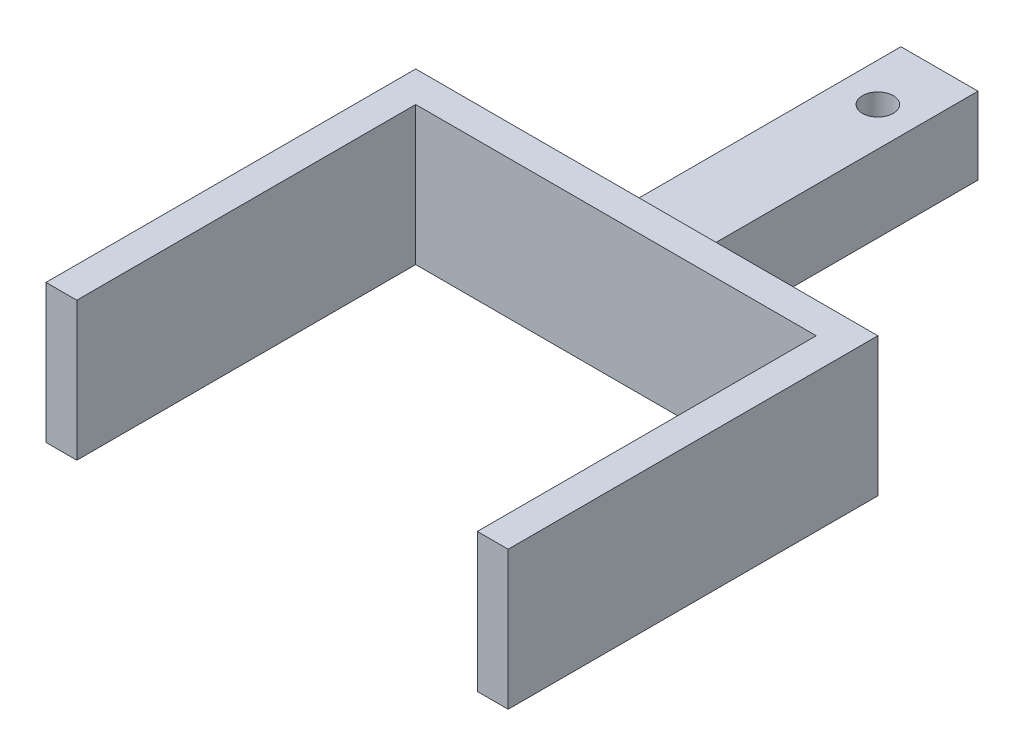
ISO-10303-21;
HEADER;
FILE_DESCRIPTION(('STEP AP214'),'2;1');
FILE_NAME('part.step','',(''),(''),'','','');
FILE_SCHEMA(('AUTOMOTIVE_DESIGN { 1 0 10303 214 1 1 1 1 }'));
ENDSEC;
DATA;
#1=APPLICATION_CONTEXT('core data for automotive mechanical design processes');
#2=APPLICATION_PROTOCOL_DEFINITION('international standard','automotive_design',2000,#1);
#3=PRODUCT_CONTEXT('',#1,'mechanical');
#4=PRODUCT('Part','Part','',(#3));
#5=PRODUCT_RELATED_PRODUCT_CATEGORY('part','',(#4));
#6=PRODUCT_DEFINITION_FORMATION('','',#4);
#7=PRODUCT_DEFINITION_CONTEXT('part definition',#1,'design');
#8=PRODUCT_DEFINITION('design','',#6,#7);
#9=PRODUCT_DEFINITION_SHAPE('','',#8);
#10=(LENGTH_UNIT() NAMED_UNIT(*) SI_UNIT(.MILLI.,.METRE.));
#11=(NAMED_UNIT(*) PLANE_ANGLE_UNIT() SI_UNIT($,.RADIAN.));
#12=(NAMED_UNIT(*) SI_UNIT($,.STERADIAN.) SOLID_ANGLE_UNIT());
#13=UNCERTAINTY_MEASURE_WITH_UNIT(LENGTH_MEASURE(1.E-05),#10,'distance_accuracy_value','');
#14=(GEOMETRIC_REPRESENTATION_CONTEXT(3) GLOBAL_UNCERTAINTY_ASSIGNED_CONTEXT((#13)) GLOBAL_UNIT_ASSIGNED_CONTEXT((#10,
#11,#12)) REPRESENTATION_CONTEXT('',''));
#15=CARTESIAN_POINT('',(0.,0.,0.));
#16=DIRECTION('',(0.,0.,1.));
#17=DIRECTION('',(1.,0.,0.));
#18=AXIS2_PLACEMENT_3D('',#15,#16,#17);
#19=CARTESIAN_POINT('',(-12.5,-35.,20.));
#20=DIRECTION('',(0.,1.,0.));
#21=DIRECTION('',(0.,0.,1.));
#22=AXIS2_PLACEMENT_3D('',#19,#20,#21);
#23=CYLINDRICAL_SURFACE('',#22,5.);
#24=CARTESIAN_POINT('',(-12.5,0.,20.));
#25=DIRECTION('',(0.,1.,0.));
#26=DIRECTION('',(0.,0.,1.));
#27=AXIS2_PLACEMENT_3D('',#24,#25,#26);
#28=CIRCLE('',#27,5.);
#29=CARTESIAN_POINT('',(-12.5,0.,25.));
#30=VERTEX_POINT('',#29);
#31=EDGE_CURVE('E146',#30,#30,#28,.T.);
#32=ORIENTED_EDGE('',*,*,#31,.T.);
#33=EDGE_LOOP('',(#32));
#34=FACE_BOUND('',#33,.T.);
#35=CARTESIAN_POINT('',(-12.5,-15.,20.));
#36=DIRECTION('',(0.,-1.,0.));
#37=DIRECTION('',(0.,0.,-1.));
#38=AXIS2_PLACEMENT_3D('',#35,#36,#37);
#39=CIRCLE('',#38,5.);
#40=CARTESIAN_POINT('',(-12.5,-15.,15.));
#41=VERTEX_POINT('',#40);
#42=EDGE_CURVE('E39',#41,#41,#39,.F.);
#43=ORIENTED_EDGE('',*,*,#42,.F.);
#44=EDGE_LOOP('',(#43));
#45=FACE_BOUND('',#44,.T.);
#46=ADVANCED_FACE('F35',(#34,#45),#23,.F.);
#47=CARTESIAN_POINT('',(0.,0.,95.));
#48=DIRECTION('',(-1.,0.,0.));
#49=DIRECTION('',(0.,0.,1.));
#50=AXIS2_PLACEMENT_3D('',#47,#48,#49);
#51=PLANE('',#50);
#52=DIRECTION('',(0.,1.,0.));
#53=VECTOR('',#52,1.);
#54=CARTESIAN_POINT('',(0.,0.,0.));
#55=LINE('',#54,#53);
#56=CARTESIAN_POINT('',(0.,-25.,0.));
#57=VERTEX_POINT('',#56);
#58=CARTESIAN_POINT('',(0.,0.,0.));
#59=VERTEX_POINT('',#58);
#60=EDGE_CURVE('E205',#57,#59,#55,.T.);
#61=ORIENTED_EDGE('',*,*,#60,.T.);
#62=DIRECTION('',(0.,0.,-1.));
#63=VECTOR('',#62,1.);
#64=CARTESIAN_POINT('',(0.,0.,95.));
#65=LINE('',#64,#63);
#66=CARTESIAN_POINT('',(0.,0.,95.));
#67=VERTEX_POINT('',#66);
#68=EDGE_CURVE('E11',#67,#59,#65,.T.);
#69=ORIENTED_EDGE('',*,*,#68,.F.);
#70=DIRECTION('',(0.,1.,0.));
#71=VECTOR('',#70,1.);
#72=CARTESIAN_POINT('',(0.,0.,95.));
#73=LINE('',#72,#71);
#74=CARTESIAN_POINT('',(0.,-25.,95.));
#75=VERTEX_POINT('',#74);
#76=EDGE_CURVE('E208',#75,#67,#73,.T.);
#77=ORIENTED_EDGE('',*,*,#76,.F.);
#78=DIRECTION('',(0.,0.,-1.));
#79=VECTOR('',#78,1.);
#80=CARTESIAN_POINT('',(0.,-25.,95.));
#81=LINE('',#80,#79);
#82=EDGE_CURVE('E218',#75,#57,#81,.T.);
#83=ORIENTED_EDGE('',*,*,#82,.T.);
#84=EDGE_LOOP('',(#61,#69,#77,#83));
#85=FACE_BOUND('',#84,.T.);
#86=ADVANCED_FACE('F37',(#85),#51,.F.);
#87=CARTESIAN_POINT('',(0.,0.,95.));
#88=DIRECTION('',(0.,-1.,0.));
#89=DIRECTION('',(0.,0.,-1.));
#90=AXIS2_PLACEMENT_3D('',#87,#88,#89);
#91=PLANE('',#90);
#92=ORIENTED_EDGE('',*,*,#31,.F.);
#93=EDGE_LOOP('',(#92));
#94=FACE_BOUND('',#93,.T.);
#95=DIRECTION('',(-1.,0.,0.));
#96=VECTOR('',#95,1.);
#97=CARTESIAN_POINT('',(0.,0.,0.));
#98=LINE('',#97,#96);
#99=CARTESIAN_POINT('',(-25.,0.,0.));
#100=VERTEX_POINT('',#99);
#101=EDGE_CURVE('E221',#59,#100,#98,.T.);
#102=ORIENTED_EDGE('',*,*,#101,.T.);
#103=DIRECTION('',(0.,0.,-1.));
#104=VECTOR('',#103,1.);
#105=CARTESIAN_POINT('',(-25.,0.,95.));
#106=LINE('',#105,#104);
#107=CARTESIAN_POINT('',(-25.,0.,95.));
#108=VERTEX_POINT('',#107);
#109=EDGE_CURVE('E45',#108,#100,#106,.T.);
#110=ORIENTED_EDGE('',*,*,#109,.F.);
#111=DIRECTION('',(-1.,0.,0.));
#112=VECTOR('',#111,1.);
#113=CARTESIAN_POINT('',(0.,0.,95.));
#114=LINE('',#113,#112);
#115=EDGE_CURVE('E79',#67,#108,#114,.T.);
#116=ORIENTED_EDGE('',*,*,#115,.F.);
#117=ORIENTED_EDGE('',*,*,#68,.T.);
#118=EDGE_LOOP('',(#102,#110,#116,#117));
#119=FACE_BOUND('',#118,.T.);
#120=ADVANCED_FACE('F281',(#94,#119),#91,.F.);
#121=CARTESIAN_POINT('',(-25.,0.,95.));
#122=DIRECTION('',(1.,0.,0.));
#123=DIRECTION('',(0.,0.,-1.));
#124=AXIS2_PLACEMENT_3D('',#121,#122,#123);
#125=PLANE('',#124);
#126=DIRECTION('',(0.,-1.,0.));
#127=VECTOR('',#126,1.);
#128=CARTESIAN_POINT('',(-25.,0.,0.));
#129=LINE('',#128,#127);
#130=CARTESIAN_POINT('',(-25.,-25.,0.));
#131=VERTEX_POINT('',#130);
#132=EDGE_CURVE('E69',#100,#131,#129,.T.);
#133=ORIENTED_EDGE('',*,*,#132,.T.);
#134=DIRECTION('',(0.,0.,-1.));
#135=VECTOR('',#134,1.);
#136=CARTESIAN_POINT('',(-25.,-25.,95.));
#137=LINE('',#136,#135);
#138=CARTESIAN_POINT('',(-25.,-25.,95.));
#139=VERTEX_POINT('',#138);
#140=EDGE_CURVE('E53',#139,#131,#137,.T.);
#141=ORIENTED_EDGE('',*,*,#140,.F.);
#142=DIRECTION('',(0.,-1.,0.));
#143=VECTOR('',#142,1.);
#144=CARTESIAN_POINT('',(-25.,0.,95.));
#145=LINE('',#144,#143);
#146=EDGE_CURVE('E212',#108,#139,#145,.T.);
#147=ORIENTED_EDGE('',*,*,#146,.F.);
#148=ORIENTED_EDGE('',*,*,#109,.T.);
#149=EDGE_LOOP('',(#133,#141,#147,#148));
#150=FACE_BOUND('',#149,.T.);
#151=ADVANCED_FACE('F227',(#150),#125,.F.);
#152=CARTESIAN_POINT('',(0.,-25.,95.));
#153=DIRECTION('',(0.,1.,0.));
#154=DIRECTION('',(0.,0.,1.));
#155=AXIS2_PLACEMENT_3D('',#152,#153,#154);
#156=PLANE('',#155);
#157=CARTESIAN_POINT('',(-12.4999999999744,-25.,20.0000000000058));
#158=DIRECTION('',(0.,-1.,0.));
#159=DIRECTION('',(0.,0.,-1.));
#160=AXIS2_PLACEMENT_3D('',#157,#158,#159);
#161=CIRCLE('',#160,9.99799233881573);
#162=CARTESIAN_POINT('',(-12.4999999999744,-25.,10.0020076611901));
#163=VERTEX_POINT('',#162);
#164=EDGE_CURVE('E263',#163,#163,#161,.T.);
#165=ORIENTED_EDGE('',*,*,#164,.F.);
#166=EDGE_LOOP('',(#165));
#167=FACE_BOUND('',#166,.T.);
#168=DIRECTION('',(1.,0.,0.));
#169=VECTOR('',#168,1.);
#170=CARTESIAN_POINT('',(0.,-25.,0.));
#171=LINE('',#170,#169);
#172=EDGE_CURVE('E74',#131,#57,#171,.T.);
#173=ORIENTED_EDGE('',*,*,#172,.T.);
#174=ORIENTED_EDGE('',*,*,#82,.F.);
#175=DIRECTION('',(1.,0.,0.));
#176=VECTOR('',#175,1.);
#177=CARTESIAN_POINT('',(0.,-25.,95.));
#178=LINE('',#177,#176);
#179=EDGE_CURVE('E215',#139,#75,#178,.T.);
#180=ORIENTED_EDGE('',*,*,#179,.F.);
#181=ORIENTED_EDGE('',*,*,#140,.T.);
#182=EDGE_LOOP('',(#173,#174,#180,#181));
#183=FACE_BOUND('',#182,.T.);
#184=ADVANCED_FACE('F232',(#167,#183),#156,.F.);
#185=CARTESIAN_POINT('',(0.,0.,0.));
#186=DIRECTION('',(0.,0.,-1.));
#187=DIRECTION('',(-1.,0.,0.));
#188=AXIS2_PLACEMENT_3D('',#185,#186,#187);
#189=PLANE('',#188);
#190=ORIENTED_EDGE('',*,*,#60,.F.);
#191=ORIENTED_EDGE('',*,*,#172,.F.);
#192=ORIENTED_EDGE('',*,*,#132,.F.);
#193=ORIENTED_EDGE('',*,*,#101,.F.);
#194=EDGE_LOOP('',(#190,#191,#192,#193));
#195=FACE_BOUND('',#194,.T.);
#196=ADVANCED_FACE('F230',(#195),#189,.T.);
#197=CARTESIAN_POINT('',(52.5,-35.,105.));
#198=DIRECTION('',(0.,1.,0.));
#199=DIRECTION('',(-1.,0.,0.));
#200=AXIS2_PLACEMENT_3D('',#197,#198,#199);
#201=PLANE('',#200);
#202=DIRECTION('',(1.,0.,0.));
#203=VECTOR('',#202,1.);
#204=CARTESIAN_POINT('',(52.5,-35.,95.));
#205=LINE('',#204,#203);
#206=CARTESIAN_POINT('',(-87.5,-35.,95.));
#207=VERTEX_POINT('',#206);
#208=CARTESIAN_POINT('',(62.5,-35.,95.));
#209=VERTEX_POINT('',#208);
#210=EDGE_CURVE('E181',#207,#209,#205,.T.);
#211=ORIENTED_EDGE('',*,*,#210,.T.);
#212=DIRECTION('',(0.,0.,1.));
#213=VECTOR('',#212,1.);
#214=CARTESIAN_POINT('',(62.5,-35.,95.));
#215=LINE('',#214,#213);
#216=CARTESIAN_POINT('',(62.5,-35.,215.));
#217=VERTEX_POINT('',#216);
#218=EDGE_CURVE('E172',#209,#217,#215,.T.);
#219=ORIENTED_EDGE('',*,*,#218,.T.);
#220=DIRECTION('',(-1.,0.,0.));
#221=VECTOR('',#220,1.);
#222=CARTESIAN_POINT('',(52.5,-35.,215.));
#223=LINE('',#222,#221);
#224=CARTESIAN_POINT('',(52.5,-35.,215.));
#225=VERTEX_POINT('',#224);
#226=EDGE_CURVE('E168',#217,#225,#223,.T.);
#227=ORIENTED_EDGE('',*,*,#226,.T.);
#228=DIRECTION('',(0.,0.,-1.));
#229=VECTOR('',#228,1.);
#230=CARTESIAN_POINT('',(52.5,-35.,95.));
#231=LINE('',#230,#229);
#232=CARTESIAN_POINT('',(52.5,-35.,105.));
#233=VERTEX_POINT('',#232);
#234=EDGE_CURVE('E153',#225,#233,#231,.T.);
#235=ORIENTED_EDGE('',*,*,#234,.T.);
#236=DIRECTION('',(1.,0.,0.));
#237=VECTOR('',#236,1.);
#238=CARTESIAN_POINT('',(52.5,-35.,105.));
#239=LINE('',#238,#237);
#240=CARTESIAN_POINT('',(-77.5,-35.,105.));
#241=VERTEX_POINT('',#240);
#242=EDGE_CURVE('E198',#241,#233,#239,.T.);
#243=ORIENTED_EDGE('',*,*,#242,.F.);
#244=DIRECTION('',(0.,0.,1.));
#245=VECTOR('',#244,1.);
#246=CARTESIAN_POINT('',(-77.5,-35.,95.));
#247=LINE('',#246,#245);
#248=CARTESIAN_POINT('',(-77.5,-35.,215.));
#249=VERTEX_POINT('',#248);
#250=EDGE_CURVE('E179',#241,#249,#247,.T.);
#251=ORIENTED_EDGE('',*,*,#250,.T.);
#252=DIRECTION('',(-1.,0.,0.));
#253=VECTOR('',#252,1.);
#254=CARTESIAN_POINT('',(-77.5,-35.,215.));
#255=LINE('',#254,#253);
#256=CARTESIAN_POINT('',(-87.5,-35.,215.));
#257=VERTEX_POINT('',#256);
#258=EDGE_CURVE('E176',#249,#257,#255,.T.);
#259=ORIENTED_EDGE('',*,*,#258,.T.);
#260=DIRECTION('',(0.,0.,-1.));
#261=VECTOR('',#260,1.);
#262=CARTESIAN_POINT('',(-87.5,-35.,95.));
#263=LINE('',#262,#261);
#264=EDGE_CURVE('E173',#257,#207,#263,.T.);
#265=ORIENTED_EDGE('',*,*,#264,.T.);
#266=EDGE_LOOP('',(#211,#219,#227,#235,#243,#251,#259,#265));
#267=FACE_BOUND('',#266,.T.);
#268=ADVANCED_FACE('F246',(#267),#201,.F.);
#269=CARTESIAN_POINT('',(52.5,9.99999999999999,105.));
#270=DIRECTION('',(0.,-1.,0.));
#271=DIRECTION('',(1.,0.,0.));
#272=AXIS2_PLACEMENT_3D('',#269,#270,#271);
#273=PLANE('',#272);
#274=DIRECTION('',(-1.,0.,0.));
#275=VECTOR('',#274,1.);
#276=CARTESIAN_POINT('',(52.5,9.99999999999999,95.));
#277=LINE('',#276,#275);
#278=CARTESIAN_POINT('',(62.5,9.99999999999999,95.));
#279=VERTEX_POINT('',#278);
#280=CARTESIAN_POINT('',(-87.5,9.99999999999997,95.));
#281=VERTEX_POINT('',#280);
#282=EDGE_CURVE('E199',#279,#281,#277,.T.);
#283=ORIENTED_EDGE('',*,*,#282,.T.);
#284=DIRECTION('',(0.,0.,1.));
#285=VECTOR('',#284,1.);
#286=CARTESIAN_POINT('',(-87.5,9.99999999999997,95.));
#287=LINE('',#286,#285);
#288=CARTESIAN_POINT('',(-87.5,9.99999999999997,215.));
#289=VERTEX_POINT('',#288);
#290=EDGE_CURVE('E183',#281,#289,#287,.T.);
#291=ORIENTED_EDGE('',*,*,#290,.T.);
#292=DIRECTION('',(1.,0.,0.));
#293=VECTOR('',#292,1.);
#294=CARTESIAN_POINT('',(-77.5,9.99999999999998,215.));
#295=LINE('',#294,#293);
#296=CARTESIAN_POINT('',(-77.5,9.99999999999998,215.));
#297=VERTEX_POINT('',#296);
#298=EDGE_CURVE('E186',#289,#297,#295,.T.);
#299=ORIENTED_EDGE('',*,*,#298,.T.);
#300=DIRECTION('',(0.,0.,-1.));
#301=VECTOR('',#300,1.);
#302=CARTESIAN_POINT('',(-77.5,9.99999999999998,95.));
#303=LINE('',#302,#301);
#304=CARTESIAN_POINT('',(-77.5,9.99999999999998,105.));
#305=VERTEX_POINT('',#304);
#306=EDGE_CURVE('E171',#297,#305,#303,.T.);
#307=ORIENTED_EDGE('',*,*,#306,.T.);
#308=DIRECTION('',(-1.,0.,0.));
#309=VECTOR('',#308,1.);
#310=CARTESIAN_POINT('',(52.5,9.99999999999999,105.));
#311=LINE('',#310,#309);
#312=CARTESIAN_POINT('',(52.5,9.99999999999999,105.));
#313=VERTEX_POINT('',#312);
#314=EDGE_CURVE('E143',#313,#305,#311,.T.);
#315=ORIENTED_EDGE('',*,*,#314,.F.);
#316=DIRECTION('',(0.,0.,1.));
#317=VECTOR('',#316,1.);
#318=CARTESIAN_POINT('',(52.5,9.99999999999999,95.));
#319=LINE('',#318,#317);
#320=CARTESIAN_POINT('',(52.5,9.99999999999999,215.));
#321=VERTEX_POINT('',#320);
#322=EDGE_CURVE('E134',#313,#321,#319,.T.);
#323=ORIENTED_EDGE('',*,*,#322,.T.);
#324=DIRECTION('',(1.,0.,0.));
#325=VECTOR('',#324,1.);
#326=CARTESIAN_POINT('',(52.5,9.99999999999999,215.));
#327=LINE('',#326,#325);
#328=CARTESIAN_POINT('',(62.5,9.99999999999999,215.));
#329=VERTEX_POINT('',#328);
#330=EDGE_CURVE('E139',#321,#329,#327,.T.);
#331=ORIENTED_EDGE('',*,*,#330,.T.);
#332=DIRECTION('',(0.,0.,-1.));
#333=VECTOR('',#332,1.);
#334=CARTESIAN_POINT('',(62.5,9.99999999999999,95.));
#335=LINE('',#334,#333);
#336=EDGE_CURVE('E157',#329,#279,#335,.T.);
#337=ORIENTED_EDGE('',*,*,#336,.T.);
#338=EDGE_LOOP('',(#283,#291,#299,#307,#315,#323,#331,#337));
#339=FACE_BOUND('',#338,.T.);
#340=ADVANCED_FACE('F136',(#339),#273,.F.);
#341=CARTESIAN_POINT('',(0.,0.,105.));
#342=DIRECTION('',(0.,0.,-1.));
#343=DIRECTION('',(-1.,0.,0.));
#344=AXIS2_PLACEMENT_3D('',#341,#342,#343);
#345=PLANE('',#344);
#346=DIRECTION('',(0.,-1.,0.));
#347=VECTOR('',#346,1.);
#348=CARTESIAN_POINT('',(-77.5,9.99999999999998,105.));
#349=LINE('',#348,#347);
#350=EDGE_CURVE('E195',#305,#241,#349,.T.);
#351=ORIENTED_EDGE('',*,*,#350,.T.);
#352=ORIENTED_EDGE('',*,*,#242,.T.);
#353=DIRECTION('',(0.,1.,0.));
#354=VECTOR('',#353,1.);
#355=CARTESIAN_POINT('',(52.5,9.99999999999999,105.));
#356=LINE('',#355,#354);
#357=EDGE_CURVE('E202',#233,#313,#356,.T.);
#358=ORIENTED_EDGE('',*,*,#357,.T.);
#359=ORIENTED_EDGE('',*,*,#314,.T.);
#360=EDGE_LOOP('',(#351,#352,#358,#359));
#361=FACE_BOUND('',#360,.T.);
#362=ADVANCED_FACE('F238',(#361),#345,.F.);
#363=CARTESIAN_POINT('',(0.,0.,95.));
#364=DIRECTION('',(0.,0.,-1.));
#365=DIRECTION('',(-1.,0.,0.));
#366=AXIS2_PLACEMENT_3D('',#363,#364,#365);
#367=PLANE('',#366);
#368=ORIENTED_EDGE('',*,*,#179,.T.);
#369=ORIENTED_EDGE('',*,*,#76,.T.);
#370=ORIENTED_EDGE('',*,*,#115,.T.);
#371=ORIENTED_EDGE('',*,*,#146,.T.);
#372=EDGE_LOOP('',(#368,#369,#370,#371));
#373=FACE_BOUND('',#372,.T.);
#374=ORIENTED_EDGE('',*,*,#210,.F.);
#375=DIRECTION('',(0.,1.,0.));
#376=VECTOR('',#375,1.);
#377=CARTESIAN_POINT('',(-87.5,-155.415945787923,95.));
#378=LINE('',#377,#376);
#379=EDGE_CURVE('E189',#207,#281,#378,.T.);
#380=ORIENTED_EDGE('',*,*,#379,.T.);
#381=ORIENTED_EDGE('',*,*,#282,.F.);
#382=DIRECTION('',(0.,1.,0.));
#383=VECTOR('',#382,1.);
#384=CARTESIAN_POINT('',(62.5,-155.415945787923,95.));
#385=LINE('',#384,#383);
#386=EDGE_CURVE('E165',#209,#279,#385,.T.);
#387=ORIENTED_EDGE('',*,*,#386,.F.);
#388=EDGE_LOOP('',(#374,#380,#381,#387));
#389=FACE_BOUND('',#388,.T.);
#390=ADVANCED_FACE('F234',(#373,#389),#367,.T.);
#391=CARTESIAN_POINT('',(-77.5,-155.415945787923,95.));
#392=DIRECTION('',(1.,0.,0.));
#393=DIRECTION('',(0.,1.,0.));
#394=AXIS2_PLACEMENT_3D('',#391,#392,#393);
#395=PLANE('',#394);
#396=ORIENTED_EDGE('',*,*,#350,.F.);
#397=ORIENTED_EDGE('',*,*,#306,.F.);
#398=DIRECTION('',(0.,1.,0.));
#399=VECTOR('',#398,1.);
#400=CARTESIAN_POINT('',(-77.5,-155.415945787923,215.));
#401=LINE('',#400,#399);
#402=EDGE_CURVE('E177',#249,#297,#401,.T.);
#403=ORIENTED_EDGE('',*,*,#402,.F.);
#404=ORIENTED_EDGE('',*,*,#250,.F.);
#405=EDGE_LOOP('',(#396,#397,#403,#404));
#406=FACE_BOUND('',#405,.T.);
#407=ADVANCED_FACE('F237',(#406),#395,.T.);
#408=CARTESIAN_POINT('',(-77.5,-155.415945787923,215.));
#409=DIRECTION('',(0.,0.,1.));
#410=DIRECTION('',(1.,0.,0.));
#411=AXIS2_PLACEMENT_3D('',#408,#409,#410);
#412=PLANE('',#411);
#413=ORIENTED_EDGE('',*,*,#258,.F.);
#414=ORIENTED_EDGE('',*,*,#402,.T.);
#415=ORIENTED_EDGE('',*,*,#298,.F.);
#416=DIRECTION('',(0.,1.,0.));
#417=VECTOR('',#416,1.);
#418=CARTESIAN_POINT('',(-87.5,-155.415945787923,215.));
#419=LINE('',#418,#417);
#420=EDGE_CURVE('E191',#257,#289,#419,.T.);
#421=ORIENTED_EDGE('',*,*,#420,.F.);
#422=EDGE_LOOP('',(#413,#414,#415,#421));
#423=FACE_BOUND('',#422,.T.);
#424=ADVANCED_FACE('F253',(#423),#412,.T.);
#425=CARTESIAN_POINT('',(-87.5,-155.415945787923,95.));
#426=DIRECTION('',(-1.,0.,0.));
#427=DIRECTION('',(0.,-1.,0.));
#428=AXIS2_PLACEMENT_3D('',#425,#426,#427);
#429=PLANE('',#428);
#430=ORIENTED_EDGE('',*,*,#264,.F.);
#431=ORIENTED_EDGE('',*,*,#420,.T.);
#432=ORIENTED_EDGE('',*,*,#290,.F.);
#433=ORIENTED_EDGE('',*,*,#379,.F.);
#434=EDGE_LOOP('',(#430,#431,#432,#433));
#435=FACE_BOUND('',#434,.T.);
#436=ADVANCED_FACE('F250',(#435),#429,.T.);
#437=CARTESIAN_POINT('',(52.5,-155.415945787923,95.));
#438=DIRECTION('',(-1.,0.,0.));
#439=DIRECTION('',(0.,-1.,0.));
#440=AXIS2_PLACEMENT_3D('',#437,#438,#439);
#441=PLANE('',#440);
#442=ORIENTED_EDGE('',*,*,#357,.F.);
#443=ORIENTED_EDGE('',*,*,#234,.F.);
#444=DIRECTION('',(0.,1.,0.));
#445=VECTOR('',#444,1.);
#446=CARTESIAN_POINT('',(52.5,-155.415945787923,215.));
#447=LINE('',#446,#445);
#448=EDGE_CURVE('E150',#225,#321,#447,.T.);
#449=ORIENTED_EDGE('',*,*,#448,.T.);
#450=ORIENTED_EDGE('',*,*,#322,.F.);
#451=EDGE_LOOP('',(#442,#443,#449,#450));
#452=FACE_BOUND('',#451,.T.);
#453=ADVANCED_FACE('F151',(#452),#441,.T.);
#454=CARTESIAN_POINT('',(62.5,-155.415945787923,95.));
#455=DIRECTION('',(1.,0.,0.));
#456=DIRECTION('',(0.,1.,0.));
#457=AXIS2_PLACEMENT_3D('',#454,#455,#456);
#458=PLANE('',#457);
#459=ORIENTED_EDGE('',*,*,#218,.F.);
#460=ORIENTED_EDGE('',*,*,#386,.T.);
#461=ORIENTED_EDGE('',*,*,#336,.F.);
#462=DIRECTION('',(0.,1.,0.));
#463=VECTOR('',#462,1.);
#464=CARTESIAN_POINT('',(62.5,-155.415945787923,215.));
#465=LINE('',#464,#463);
#466=EDGE_CURVE('E156',#217,#329,#465,.T.);
#467=ORIENTED_EDGE('',*,*,#466,.F.);
#468=EDGE_LOOP('',(#459,#460,#461,#467));
#469=FACE_BOUND('',#468,.T.);
#470=ADVANCED_FACE('F286',(#469),#458,.T.);
#471=CARTESIAN_POINT('',(52.5,-155.415945787923,215.));
#472=DIRECTION('',(0.,0.,1.));
#473=DIRECTION('',(1.,0.,0.));
#474=AXIS2_PLACEMENT_3D('',#471,#472,#473);
#475=PLANE('',#474);
#476=ORIENTED_EDGE('',*,*,#226,.F.);
#477=ORIENTED_EDGE('',*,*,#466,.T.);
#478=ORIENTED_EDGE('',*,*,#330,.F.);
#479=ORIENTED_EDGE('',*,*,#448,.F.);
#480=EDGE_LOOP('',(#476,#477,#478,#479));
#481=FACE_BOUND('',#480,.T.);
#482=ADVANCED_FACE('F159',(#481),#475,.T.);
#483=CARTESIAN_POINT('',(-12.4999999999744,-15.,20.0000000000058));
#484=DIRECTION('',(0.,-1.,0.));
#485=DIRECTION('',(0.,0.,-1.));
#486=AXIS2_PLACEMENT_3D('',#483,#484,#485);
#487=PLANE('',#486);
#488=CARTESIAN_POINT('',(-12.4999999999744,-15.,20.0000000000058));
#489=DIRECTION('',(0.,-1.,0.));
#490=DIRECTION('',(0.,0.,-1.));
#491=AXIS2_PLACEMENT_3D('',#488,#489,#490);
#492=CIRCLE('',#491,9.99799233881573);
#493=CARTESIAN_POINT('',(-12.4999999999744,-15.,10.0020076611901));
#494=VERTEX_POINT('',#493);
#495=EDGE_CURVE('E266',#494,#494,#492,.T.);
#496=ORIENTED_EDGE('',*,*,#495,.T.);
#497=EDGE_LOOP('',(#496));
#498=FACE_BOUND('',#497,.T.);
#499=ORIENTED_EDGE('',*,*,#42,.T.);
#500=EDGE_LOOP('',(#499));
#501=FACE_BOUND('',#500,.T.);
#502=ADVANCED_FACE('F273',(#498,#501),#487,.T.);
#503=CARTESIAN_POINT('',(-12.4999999999744,-15.,20.0000000000058));
#504=DIRECTION('',(0.,-1.,0.));
#505=DIRECTION('',(0.,0.,-1.));
#506=AXIS2_PLACEMENT_3D('',#503,#504,#505);
#507=CYLINDRICAL_SURFACE('',#506,9.99799233881573);
#508=ORIENTED_EDGE('',*,*,#495,.F.);
#509=EDGE_LOOP('',(#508));
#510=FACE_BOUND('',#509,.T.);
#511=ORIENTED_EDGE('',*,*,#164,.T.);
#512=EDGE_LOOP('',(#511));
#513=FACE_BOUND('',#512,.T.);
#514=ADVANCED_FACE('F284',(#510,#513),#507,.F.);
#515=CLOSED_SHELL('',(#46,#86,#120,#151,#184,#196,#268,#340,#362,#390,#407,#424,#436,#453,#470,
#482,#502,#514));
#516=MANIFOLD_SOLID_BREP('B2',#515);
#517=ADVANCED_BREP_SHAPE_REPRESENTATION('',(#18,#516),#14);
#518=SHAPE_DEFINITION_REPRESENTATION(#9,#517);
ENDSEC;
END-ISO-10303-21;
